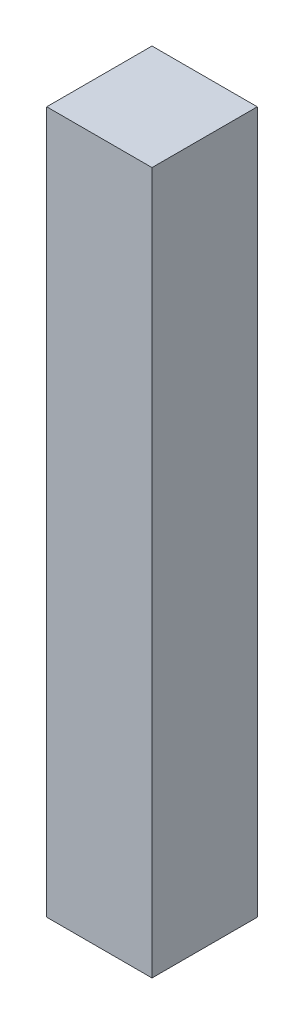
ISO-10303-21;
HEADER;
FILE_DESCRIPTION(('STEP AP214'),'2;1');
FILE_NAME('part.step','',(''),(''),'','','');
FILE_SCHEMA(('AUTOMOTIVE_DESIGN { 1 0 10303 214 1 1 1 1 }'));
ENDSEC;
DATA;
#1=APPLICATION_CONTEXT('core data for automotive mechanical design processes');
#2=APPLICATION_PROTOCOL_DEFINITION('international standard','automotive_design',2000,#1);
#3=PRODUCT_CONTEXT('',#1,'mechanical');
#4=PRODUCT('Part','Part','',(#3));
#5=PRODUCT_RELATED_PRODUCT_CATEGORY('part','',(#4));
#6=PRODUCT_DEFINITION_FORMATION('','',#4);
#7=PRODUCT_DEFINITION_CONTEXT('part definition',#1,'design');
#8=PRODUCT_DEFINITION('design','',#6,#7);
#9=PRODUCT_DEFINITION_SHAPE('','',#8);
#10=(LENGTH_UNIT() NAMED_UNIT(*) SI_UNIT(.MILLI.,.METRE.));
#11=(NAMED_UNIT(*) PLANE_ANGLE_UNIT() SI_UNIT($,.RADIAN.));
#12=(NAMED_UNIT(*) SI_UNIT($,.STERADIAN.) SOLID_ANGLE_UNIT());
#13=UNCERTAINTY_MEASURE_WITH_UNIT(LENGTH_MEASURE(1.E-05),#10,'distance_accuracy_value','');
#14=(GEOMETRIC_REPRESENTATION_CONTEXT(3) GLOBAL_UNCERTAINTY_ASSIGNED_CONTEXT((#13)) GLOBAL_UNIT_ASSIGNED_CONTEXT((#10,
#11,#12)) REPRESENTATION_CONTEXT('',''));
#15=CARTESIAN_POINT('',(0.,0.,0.));
#16=DIRECTION('',(0.,0.,1.));
#17=DIRECTION('',(1.,0.,0.));
#18=AXIS2_PLACEMENT_3D('',#15,#16,#17);
#19=CARTESIAN_POINT('',(7.5,100.,-7.5));
#20=DIRECTION('',(-1.,0.,0.));
#21=DIRECTION('',(0.,0.,1.));
#22=AXIS2_PLACEMENT_3D('',#19,#20,#21);
#23=PLANE('',#22);
#24=DIRECTION('',(0.,0.,-1.));
#25=VECTOR('',#24,1.);
#26=CARTESIAN_POINT('',(7.5,0.,-7.5));
#27=LINE('',#26,#25);
#28=CARTESIAN_POINT('',(7.5,0.,7.5));
#29=VERTEX_POINT('',#28);
#30=CARTESIAN_POINT('',(7.5,0.,-7.5));
#31=VERTEX_POINT('',#30);
#32=EDGE_CURVE('E113',#29,#31,#27,.T.);
#33=ORIENTED_EDGE('',*,*,#32,.T.);
#34=DIRECTION('',(0.,-1.,0.));
#35=VECTOR('',#34,1.);
#36=CARTESIAN_POINT('',(7.5,100.,-7.5));
#37=LINE('',#36,#35);
#38=CARTESIAN_POINT('',(7.5,100.,-7.5));
#39=VERTEX_POINT('',#38);
#40=EDGE_CURVE('E11',#39,#31,#37,.T.);
#41=ORIENTED_EDGE('',*,*,#40,.F.);
#42=DIRECTION('',(0.,0.,-1.));
#43=VECTOR('',#42,1.);
#44=CARTESIAN_POINT('',(7.5,100.,-7.5));
#45=LINE('',#44,#43);
#46=CARTESIAN_POINT('',(7.5,100.,7.5));
#47=VERTEX_POINT('',#46);
#48=EDGE_CURVE('E97',#47,#39,#45,.T.);
#49=ORIENTED_EDGE('',*,*,#48,.F.);
#50=DIRECTION('',(0.,-1.,0.));
#51=VECTOR('',#50,1.);
#52=CARTESIAN_POINT('',(7.5,100.,7.5));
#53=LINE('',#52,#51);
#54=EDGE_CURVE('E109',#47,#29,#53,.T.);
#55=ORIENTED_EDGE('',*,*,#54,.T.);
#56=EDGE_LOOP('',(#33,#41,#49,#55));
#57=FACE_BOUND('',#56,.T.);
#58=ADVANCED_FACE('F45',(#57),#23,.F.);
#59=CARTESIAN_POINT('',(-7.5,100.,-7.5));
#60=DIRECTION('',(0.,0.,1.));
#61=DIRECTION('',(1.,0.,0.));
#62=AXIS2_PLACEMENT_3D('',#59,#60,#61);
#63=PLANE('',#62);
#64=DIRECTION('',(-1.,0.,0.));
#65=VECTOR('',#64,1.);
#66=CARTESIAN_POINT('',(-7.5,0.,-7.5));
#67=LINE('',#66,#65);
#68=CARTESIAN_POINT('',(-7.5,0.,-7.5));
#69=VERTEX_POINT('',#68);
#70=EDGE_CURVE('E102',#31,#69,#67,.T.);
#71=ORIENTED_EDGE('',*,*,#70,.T.);
#72=DIRECTION('',(0.,-1.,0.));
#73=VECTOR('',#72,1.);
#74=CARTESIAN_POINT('',(-7.5,100.,-7.5));
#75=LINE('',#74,#73);
#76=CARTESIAN_POINT('',(-7.5,100.,-7.5));
#77=VERTEX_POINT('',#76);
#78=EDGE_CURVE('E54',#77,#69,#75,.T.);
#79=ORIENTED_EDGE('',*,*,#78,.F.);
#80=DIRECTION('',(-1.,0.,0.));
#81=VECTOR('',#80,1.);
#82=CARTESIAN_POINT('',(-7.5,100.,-7.5));
#83=LINE('',#82,#81);
#84=EDGE_CURVE('E92',#39,#77,#83,.T.);
#85=ORIENTED_EDGE('',*,*,#84,.F.);
#86=ORIENTED_EDGE('',*,*,#40,.T.);
#87=EDGE_LOOP('',(#71,#79,#85,#86));
#88=FACE_BOUND('',#87,.T.);
#89=ADVANCED_FACE('F101',(#88),#63,.F.);
#90=CARTESIAN_POINT('',(-7.5,100.,-7.5));
#91=DIRECTION('',(1.,0.,0.));
#92=DIRECTION('',(0.,0.,-1.));
#93=AXIS2_PLACEMENT_3D('',#90,#91,#92);
#94=PLANE('',#93);
#95=DIRECTION('',(0.,0.,1.));
#96=VECTOR('',#95,1.);
#97=CARTESIAN_POINT('',(-7.5,0.,-7.5));
#98=LINE('',#97,#96);
#99=CARTESIAN_POINT('',(-7.5,0.,7.5));
#100=VERTEX_POINT('',#99);
#101=EDGE_CURVE('E79',#69,#100,#98,.T.);
#102=ORIENTED_EDGE('',*,*,#101,.T.);
#103=DIRECTION('',(0.,-1.,0.));
#104=VECTOR('',#103,1.);
#105=CARTESIAN_POINT('',(-7.5,100.,7.5));
#106=LINE('',#105,#104);
#107=CARTESIAN_POINT('',(-7.5,100.,7.5));
#108=VERTEX_POINT('',#107);
#109=EDGE_CURVE('E104',#108,#100,#106,.T.);
#110=ORIENTED_EDGE('',*,*,#109,.F.);
#111=DIRECTION('',(0.,0.,1.));
#112=VECTOR('',#111,1.);
#113=CARTESIAN_POINT('',(-7.5,100.,-7.5));
#114=LINE('',#113,#112);
#115=EDGE_CURVE('E95',#77,#108,#114,.T.);
#116=ORIENTED_EDGE('',*,*,#115,.F.);
#117=ORIENTED_EDGE('',*,*,#78,.T.);
#118=EDGE_LOOP('',(#102,#110,#116,#117));
#119=FACE_BOUND('',#118,.T.);
#120=ADVANCED_FACE('F105',(#119),#94,.F.);
#121=CARTESIAN_POINT('',(-7.5,100.,7.5));
#122=DIRECTION('',(0.,0.,-1.));
#123=DIRECTION('',(-1.,0.,0.));
#124=AXIS2_PLACEMENT_3D('',#121,#122,#123);
#125=PLANE('',#124);
#126=DIRECTION('',(1.,0.,0.));
#127=VECTOR('',#126,1.);
#128=CARTESIAN_POINT('',(-7.5,0.,7.5));
#129=LINE('',#128,#127);
#130=EDGE_CURVE('E85',#100,#29,#129,.T.);
#131=ORIENTED_EDGE('',*,*,#130,.T.);
#132=ORIENTED_EDGE('',*,*,#54,.F.);
#133=DIRECTION('',(1.,0.,0.));
#134=VECTOR('',#133,1.);
#135=CARTESIAN_POINT('',(-7.5,100.,7.5));
#136=LINE('',#135,#134);
#137=EDGE_CURVE('E62',#108,#47,#136,.T.);
#138=ORIENTED_EDGE('',*,*,#137,.F.);
#139=ORIENTED_EDGE('',*,*,#109,.T.);
#140=EDGE_LOOP('',(#131,#132,#138,#139));
#141=FACE_BOUND('',#140,.T.);
#142=ADVANCED_FACE('F126',(#141),#125,.F.);
#143=CARTESIAN_POINT('',(0.,100.,0.));
#144=DIRECTION('',(0.,1.,0.));
#145=DIRECTION('',(0.,0.,1.));
#146=AXIS2_PLACEMENT_3D('',#143,#144,#145);
#147=PLANE('',#146);
#148=ORIENTED_EDGE('',*,*,#48,.T.);
#149=ORIENTED_EDGE('',*,*,#84,.T.);
#150=ORIENTED_EDGE('',*,*,#115,.T.);
#151=ORIENTED_EDGE('',*,*,#137,.T.);
#152=EDGE_LOOP('',(#148,#149,#150,#151));
#153=FACE_BOUND('',#152,.T.);
#154=ADVANCED_FACE('F93',(#153),#147,.T.);
#155=CARTESIAN_POINT('',(0.,0.,0.));
#156=DIRECTION('',(0.,1.,0.));
#157=DIRECTION('',(0.,0.,1.));
#158=AXIS2_PLACEMENT_3D('',#155,#156,#157);
#159=PLANE('',#158);
#160=ORIENTED_EDGE('',*,*,#32,.F.);
#161=ORIENTED_EDGE('',*,*,#130,.F.);
#162=ORIENTED_EDGE('',*,*,#101,.F.);
#163=ORIENTED_EDGE('',*,*,#70,.F.);
#164=EDGE_LOOP('',(#160,#161,#162,#163));
#165=FACE_BOUND('',#164,.T.);
#166=ADVANCED_FACE('F129',(#165),#159,.F.);
#167=CLOSED_SHELL('',(#58,#89,#120,#142,#154,#166));
#168=MANIFOLD_SOLID_BREP('B2',#167);
#169=ADVANCED_BREP_SHAPE_REPRESENTATION('',(#18,#168),#14);
#170=SHAPE_DEFINITION_REPRESENTATION(#9,#169);
ENDSEC;
END-ISO-10303-21;
